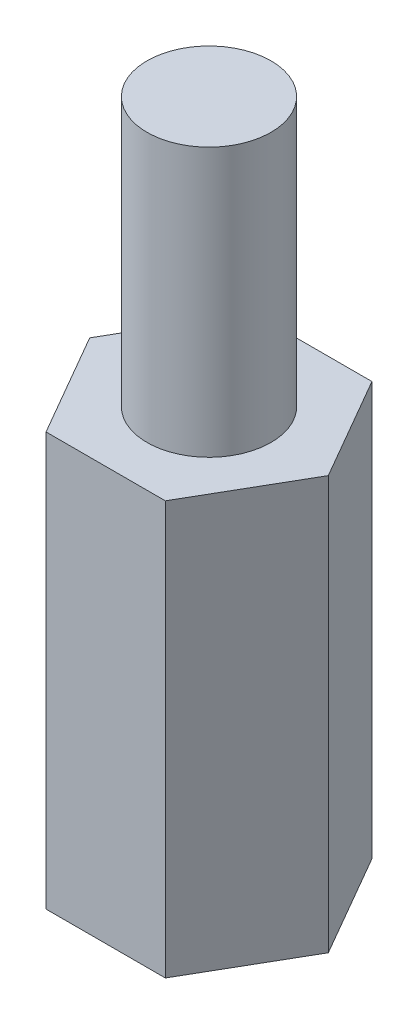
ISO-10303-21;
HEADER;
FILE_DESCRIPTION(('STEP AP214'),'2;1');
FILE_NAME('part.step','',(''),(''),'','','');
FILE_SCHEMA(('AUTOMOTIVE_DESIGN { 1 0 10303 214 1 1 1 1 }'));
ENDSEC;
DATA;
#1=APPLICATION_CONTEXT('core data for automotive mechanical design processes');
#2=APPLICATION_PROTOCOL_DEFINITION('international standard','automotive_design',2000,#1);
#3=PRODUCT_CONTEXT('',#1,'mechanical');
#4=PRODUCT('Part','Part','',(#3));
#5=PRODUCT_RELATED_PRODUCT_CATEGORY('part','',(#4));
#6=PRODUCT_DEFINITION_FORMATION('','',#4);
#7=PRODUCT_DEFINITION_CONTEXT('part definition',#1,'design');
#8=PRODUCT_DEFINITION('design','',#6,#7);
#9=PRODUCT_DEFINITION_SHAPE('','',#8);
#10=(LENGTH_UNIT() NAMED_UNIT(*) SI_UNIT(.MILLI.,.METRE.));
#11=(NAMED_UNIT(*) PLANE_ANGLE_UNIT() SI_UNIT($,.RADIAN.));
#12=(NAMED_UNIT(*) SI_UNIT($,.STERADIAN.) SOLID_ANGLE_UNIT());
#13=UNCERTAINTY_MEASURE_WITH_UNIT(LENGTH_MEASURE(1.E-05),#10,'distance_accuracy_value','');
#14=(GEOMETRIC_REPRESENTATION_CONTEXT(3) GLOBAL_UNCERTAINTY_ASSIGNED_CONTEXT((#13)) GLOBAL_UNIT_ASSIGNED_CONTEXT((#10,
#11,#12)) REPRESENTATION_CONTEXT('',''));
#15=CARTESIAN_POINT('',(0.,0.,0.));
#16=DIRECTION('',(0.,0.,1.));
#17=DIRECTION('',(1.,0.,0.));
#18=AXIS2_PLACEMENT_3D('',#15,#16,#17);
#19=CARTESIAN_POINT('',(-1.44337567297406,10.,2.5));
#20=DIRECTION('',(0.,0.,-1.));
#21=DIRECTION('',(-1.,0.,0.));
#22=AXIS2_PLACEMENT_3D('',#19,#20,#21);
#23=PLANE('',#22);
#24=DIRECTION('',(1.,0.,0.));
#25=VECTOR('',#24,1.);
#26=CARTESIAN_POINT('',(-1.44337567297406,0.,2.5));
#27=LINE('',#26,#25);
#28=CARTESIAN_POINT('',(-1.44337567297406,0.,2.5));
#29=VERTEX_POINT('',#28);
#30=CARTESIAN_POINT('',(1.44337567297406,0.,2.5));
#31=VERTEX_POINT('',#30);
#32=EDGE_CURVE('E122',#29,#31,#27,.T.);
#33=ORIENTED_EDGE('',*,*,#32,.T.);
#34=DIRECTION('',(0.,-1.,0.));
#35=VECTOR('',#34,1.);
#36=CARTESIAN_POINT('',(1.44337567297406,10.,2.5));
#37=LINE('',#36,#35);
#38=CARTESIAN_POINT('',(1.44337567297406,10.,2.5));
#39=VERTEX_POINT('',#38);
#40=EDGE_CURVE('E39',#39,#31,#37,.T.);
#41=ORIENTED_EDGE('',*,*,#40,.F.);
#42=DIRECTION('',(1.,0.,0.));
#43=VECTOR('',#42,1.);
#44=CARTESIAN_POINT('',(-1.44337567297406,10.,2.5));
#45=LINE('',#44,#43);
#46=CARTESIAN_POINT('',(-1.44337567297406,10.,2.5));
#47=VERTEX_POINT('',#46);
#48=EDGE_CURVE('E133',#47,#39,#45,.T.);
#49=ORIENTED_EDGE('',*,*,#48,.F.);
#50=DIRECTION('',(0.,-1.,0.));
#51=VECTOR('',#50,1.);
#52=CARTESIAN_POINT('',(-1.44337567297406,10.,2.5));
#53=LINE('',#52,#51);
#54=EDGE_CURVE('E118',#47,#29,#53,.T.);
#55=ORIENTED_EDGE('',*,*,#54,.T.);
#56=EDGE_LOOP('',(#33,#41,#49,#55));
#57=FACE_BOUND('',#56,.T.);
#58=ADVANCED_FACE('F36',(#57),#23,.F.);
#59=CARTESIAN_POINT('',(1.44337567297406,10.,2.5));
#60=DIRECTION('',(-0.866025403784439,0.,-0.5));
#61=DIRECTION('',(-0.5,0.,0.866025403784439));
#62=AXIS2_PLACEMENT_3D('',#59,#60,#61);
#63=PLANE('',#62);
#64=DIRECTION('',(0.5,0.,-0.866025403784439));
#65=VECTOR('',#64,1.);
#66=CARTESIAN_POINT('',(1.44337567297406,0.,2.5));
#67=LINE('',#66,#65);
#68=CARTESIAN_POINT('',(2.88675134594813,0.,0.));
#69=VERTEX_POINT('',#68);
#70=EDGE_CURVE('E125',#31,#69,#67,.T.);
#71=ORIENTED_EDGE('',*,*,#70,.T.);
#72=DIRECTION('',(0.,-1.,0.));
#73=VECTOR('',#72,1.);
#74=CARTESIAN_POINT('',(2.88675134594813,10.,0.));
#75=LINE('',#74,#73);
#76=CARTESIAN_POINT('',(2.88675134594813,10.,0.));
#77=VERTEX_POINT('',#76);
#78=EDGE_CURVE('E136',#77,#69,#75,.T.);
#79=ORIENTED_EDGE('',*,*,#78,.F.);
#80=DIRECTION('',(0.5,0.,-0.866025403784439));
#81=VECTOR('',#80,1.);
#82=CARTESIAN_POINT('',(1.44337567297406,10.,2.5));
#83=LINE('',#82,#81);
#84=EDGE_CURVE('E91',#39,#77,#83,.T.);
#85=ORIENTED_EDGE('',*,*,#84,.F.);
#86=ORIENTED_EDGE('',*,*,#40,.T.);
#87=EDGE_LOOP('',(#71,#79,#85,#86));
#88=FACE_BOUND('',#87,.T.);
#89=ADVANCED_FACE('F141',(#88),#63,.F.);
#90=CARTESIAN_POINT('',(2.88675134594813,10.,0.));
#91=DIRECTION('',(-0.866025403784438,0.,0.5));
#92=DIRECTION('',(0.5,0.,0.866025403784438));
#93=AXIS2_PLACEMENT_3D('',#90,#91,#92);
#94=PLANE('',#93);
#95=DIRECTION('',(-0.5,0.,-0.866025403784438));
#96=VECTOR('',#95,1.);
#97=CARTESIAN_POINT('',(2.88675134594813,0.,0.));
#98=LINE('',#97,#96);
#99=CARTESIAN_POINT('',(1.44337567297406,0.,-2.5));
#100=VERTEX_POINT('',#99);
#101=EDGE_CURVE('E128',#69,#100,#98,.T.);
#102=ORIENTED_EDGE('',*,*,#101,.T.);
#103=DIRECTION('',(0.,-1.,0.));
#104=VECTOR('',#103,1.);
#105=CARTESIAN_POINT('',(1.44337567297406,10.,-2.5));
#106=LINE('',#105,#104);
#107=CARTESIAN_POINT('',(1.44337567297406,10.,-2.5));
#108=VERTEX_POINT('',#107);
#109=EDGE_CURVE('E113',#108,#100,#106,.T.);
#110=ORIENTED_EDGE('',*,*,#109,.F.);
#111=DIRECTION('',(-0.5,0.,-0.866025403784438));
#112=VECTOR('',#111,1.);
#113=CARTESIAN_POINT('',(2.88675134594813,10.,0.));
#114=LINE('',#113,#112);
#115=EDGE_CURVE('E104',#77,#108,#114,.T.);
#116=ORIENTED_EDGE('',*,*,#115,.F.);
#117=ORIENTED_EDGE('',*,*,#78,.T.);
#118=EDGE_LOOP('',(#102,#110,#116,#117));
#119=FACE_BOUND('',#118,.T.);
#120=ADVANCED_FACE('F147',(#119),#94,.F.);
#121=CARTESIAN_POINT('',(1.44337567297406,10.,-2.5));
#122=DIRECTION('',(0.,0.,1.));
#123=DIRECTION('',(1.,0.,0.));
#124=AXIS2_PLACEMENT_3D('',#121,#122,#123);
#125=PLANE('',#124);
#126=DIRECTION('',(-1.,0.,0.));
#127=VECTOR('',#126,1.);
#128=CARTESIAN_POINT('',(1.44337567297406,0.,-2.5));
#129=LINE('',#128,#127);
#130=CARTESIAN_POINT('',(-1.44337567297406,0.,-2.5));
#131=VERTEX_POINT('',#130);
#132=EDGE_CURVE('E112',#100,#131,#129,.T.);
#133=ORIENTED_EDGE('',*,*,#132,.T.);
#134=DIRECTION('',(0.,-1.,0.));
#135=VECTOR('',#134,1.);
#136=CARTESIAN_POINT('',(-1.44337567297406,10.,-2.5));
#137=LINE('',#136,#135);
#138=CARTESIAN_POINT('',(-1.44337567297406,10.,-2.5));
#139=VERTEX_POINT('',#138);
#140=EDGE_CURVE('E109',#139,#131,#137,.T.);
#141=ORIENTED_EDGE('',*,*,#140,.F.);
#142=DIRECTION('',(-1.,0.,0.));
#143=VECTOR('',#142,1.);
#144=CARTESIAN_POINT('',(1.44337567297406,10.,-2.5));
#145=LINE('',#144,#143);
#146=EDGE_CURVE('E98',#108,#139,#145,.T.);
#147=ORIENTED_EDGE('',*,*,#146,.F.);
#148=ORIENTED_EDGE('',*,*,#109,.T.);
#149=EDGE_LOOP('',(#133,#141,#147,#148));
#150=FACE_BOUND('',#149,.T.);
#151=ADVANCED_FACE('F110',(#150),#125,.F.);
#152=CARTESIAN_POINT('',(-1.44337567297406,10.,-2.5));
#153=DIRECTION('',(0.866025403784439,0.,0.5));
#154=DIRECTION('',(0.5,0.,-0.866025403784439));
#155=AXIS2_PLACEMENT_3D('',#152,#153,#154);
#156=PLANE('',#155);
#157=DIRECTION('',(-0.5,0.,0.866025403784439));
#158=VECTOR('',#157,1.);
#159=CARTESIAN_POINT('',(-1.44337567297406,0.,-2.5));
#160=LINE('',#159,#158);
#161=CARTESIAN_POINT('',(-2.88675134594813,0.,0.));
#162=VERTEX_POINT('',#161);
#163=EDGE_CURVE('E76',#131,#162,#160,.T.);
#164=ORIENTED_EDGE('',*,*,#163,.T.);
#165=DIRECTION('',(0.,-1.,0.));
#166=VECTOR('',#165,1.);
#167=CARTESIAN_POINT('',(-2.88675134594813,10.,0.));
#168=LINE('',#167,#166);
#169=CARTESIAN_POINT('',(-2.88675134594813,10.,0.));
#170=VERTEX_POINT('',#169);
#171=EDGE_CURVE('E114',#170,#162,#168,.T.);
#172=ORIENTED_EDGE('',*,*,#171,.F.);
#173=DIRECTION('',(-0.5,0.,0.866025403784439));
#174=VECTOR('',#173,1.);
#175=CARTESIAN_POINT('',(-1.44337567297406,10.,-2.5));
#176=LINE('',#175,#174);
#177=EDGE_CURVE('E102',#139,#170,#176,.T.);
#178=ORIENTED_EDGE('',*,*,#177,.F.);
#179=ORIENTED_EDGE('',*,*,#140,.T.);
#180=EDGE_LOOP('',(#164,#172,#178,#179));
#181=FACE_BOUND('',#180,.T.);
#182=ADVANCED_FACE('F116',(#181),#156,.F.);
#183=CARTESIAN_POINT('',(-2.88675134594813,10.,0.));
#184=DIRECTION('',(0.866025403784438,0.,-0.500000000000001));
#185=DIRECTION('',(-0.500000000000001,0.,-0.866025403784438));
#186=AXIS2_PLACEMENT_3D('',#183,#184,#185);
#187=PLANE('',#186);
#188=DIRECTION('',(0.500000000000001,0.,0.866025403784438));
#189=VECTOR('',#188,1.);
#190=CARTESIAN_POINT('',(-2.88675134594813,0.,0.));
#191=LINE('',#190,#189);
#192=EDGE_CURVE('E82',#162,#29,#191,.T.);
#193=ORIENTED_EDGE('',*,*,#192,.T.);
#194=ORIENTED_EDGE('',*,*,#54,.F.);
#195=DIRECTION('',(0.500000000000001,0.,0.866025403784438));
#196=VECTOR('',#195,1.);
#197=CARTESIAN_POINT('',(-2.88675134594813,10.,0.));
#198=LINE('',#197,#196);
#199=EDGE_CURVE('E53',#170,#47,#198,.T.);
#200=ORIENTED_EDGE('',*,*,#199,.F.);
#201=ORIENTED_EDGE('',*,*,#171,.T.);
#202=EDGE_LOOP('',(#193,#194,#200,#201));
#203=FACE_BOUND('',#202,.T.);
#204=ADVANCED_FACE('F178',(#203),#187,.F.);
#205=CARTESIAN_POINT('',(0.,10.,0.));
#206=DIRECTION('',(0.,1.,0.));
#207=DIRECTION('',(0.,0.,1.));
#208=AXIS2_PLACEMENT_3D('',#205,#206,#207);
#209=PLANE('',#208);
#210=CARTESIAN_POINT('',(0.,10.,0.));
#211=DIRECTION('',(0.,1.,0.));
#212=DIRECTION('',(0.,0.,1.));
#213=AXIS2_PLACEMENT_3D('',#210,#211,#212);
#214=CIRCLE('',#213,1.5);
#215=CARTESIAN_POINT('',(0.,10.,-1.5));
#216=VERTEX_POINT('',#215);
#217=EDGE_CURVE('E11',#216,#216,#214,.T.);
#218=ORIENTED_EDGE('',*,*,#217,.F.);
#219=EDGE_LOOP('',(#218));
#220=FACE_BOUND('',#219,.T.);
#221=ORIENTED_EDGE('',*,*,#48,.T.);
#222=ORIENTED_EDGE('',*,*,#84,.T.);
#223=ORIENTED_EDGE('',*,*,#115,.T.);
#224=ORIENTED_EDGE('',*,*,#146,.T.);
#225=ORIENTED_EDGE('',*,*,#177,.T.);
#226=ORIENTED_EDGE('',*,*,#199,.T.);
#227=EDGE_LOOP('',(#221,#222,#223,#224,#225,#226));
#228=FACE_BOUND('',#227,.T.);
#229=ADVANCED_FACE('F100',(#220,#228),#209,.T.);
#230=CARTESIAN_POINT('',(0.,0.,0.));
#231=DIRECTION('',(0.,1.,0.));
#232=DIRECTION('',(0.,0.,1.));
#233=AXIS2_PLACEMENT_3D('',#230,#231,#232);
#234=PLANE('',#233);
#235=CARTESIAN_POINT('',(0.,0.,0.));
#236=DIRECTION('',(0.,-1.,0.));
#237=DIRECTION('',(0.,0.,-1.));
#238=AXIS2_PLACEMENT_3D('',#235,#236,#237);
#239=CIRCLE('',#238,1.5);
#240=CARTESIAN_POINT('',(0.,0.,-1.5));
#241=VERTEX_POINT('',#240);
#242=EDGE_CURVE('E154',#241,#241,#239,.T.);
#243=ORIENTED_EDGE('',*,*,#242,.F.);
#244=EDGE_LOOP('',(#243));
#245=FACE_BOUND('',#244,.T.);
#246=ORIENTED_EDGE('',*,*,#32,.F.);
#247=ORIENTED_EDGE('',*,*,#192,.F.);
#248=ORIENTED_EDGE('',*,*,#163,.F.);
#249=ORIENTED_EDGE('',*,*,#132,.F.);
#250=ORIENTED_EDGE('',*,*,#101,.F.);
#251=ORIENTED_EDGE('',*,*,#70,.F.);
#252=EDGE_LOOP('',(#246,#247,#248,#249,#250,#251));
#253=FACE_BOUND('',#252,.T.);
#254=ADVANCED_FACE('F146',(#245,#253),#234,.F.);
#255=CARTESIAN_POINT('',(0.,16.5,0.));
#256=DIRECTION('',(0.,-1.,0.));
#257=DIRECTION('',(0.,0.,-1.));
#258=AXIS2_PLACEMENT_3D('',#255,#256,#257);
#259=CYLINDRICAL_SURFACE('',#258,1.5);
#260=CARTESIAN_POINT('',(0.,16.5,0.));
#261=DIRECTION('',(0.,1.,0.));
#262=DIRECTION('',(0.,0.,1.));
#263=AXIS2_PLACEMENT_3D('',#260,#261,#262);
#264=CIRCLE('',#263,1.5);
#265=CARTESIAN_POINT('',(0.,16.5,-1.5));
#266=VERTEX_POINT('',#265);
#267=EDGE_CURVE('E126',#266,#266,#264,.T.);
#268=CARTESIAN_POINT('',(0.,16.5,-1.5));
#269=CARTESIAN_POINT('',(0.,16.4322916666667,-1.5));
#270=CARTESIAN_POINT('',(0.,16.3645833333333,-1.5));
#271=CARTESIAN_POINT('',(0.,16.2291666666667,-1.5));
#272=CARTESIAN_POINT('',(0.,16.1614583333333,-1.5));
#273=CARTESIAN_POINT('',(0.,16.0260416666667,-1.5));
#274=CARTESIAN_POINT('',(0.,15.9583333333333,-1.5));
#275=CARTESIAN_POINT('',(0.,15.8229166666667,-1.5));
#276=CARTESIAN_POINT('',(0.,15.7552083333333,-1.5));
#277=CARTESIAN_POINT('',(0.,15.6197916666667,-1.5));
#278=CARTESIAN_POINT('',(0.,15.5520833333333,-1.5));
#279=CARTESIAN_POINT('',(0.,15.4166666666667,-1.5));
#280=CARTESIAN_POINT('',(0.,15.3489583333333,-1.5));
#281=CARTESIAN_POINT('',(0.,15.2135416666667,-1.5));
#282=CARTESIAN_POINT('',(0.,15.1458333333333,-1.5));
#283=CARTESIAN_POINT('',(0.,15.0104166666667,-1.5));
#284=CARTESIAN_POINT('',(0.,14.9427083333333,-1.5));
#285=CARTESIAN_POINT('',(0.,14.8072916666667,-1.5));
#286=CARTESIAN_POINT('',(0.,14.7395833333333,-1.5));
#287=CARTESIAN_POINT('',(0.,14.6041666666667,-1.5));
#288=CARTESIAN_POINT('',(0.,14.5364583333333,-1.5));
#289=CARTESIAN_POINT('',(0.,14.4010416666667,-1.5));
#290=CARTESIAN_POINT('',(0.,14.3333333333333,-1.5));
#291=CARTESIAN_POINT('',(0.,14.1979166666667,-1.5));
#292=CARTESIAN_POINT('',(0.,14.1302083333333,-1.5));
#293=CARTESIAN_POINT('',(0.,13.9947916666667,-1.5));
#294=CARTESIAN_POINT('',(0.,13.9270833333333,-1.5));
#295=CARTESIAN_POINT('',(0.,13.7916666666667,-1.5));
#296=CARTESIAN_POINT('',(0.,13.7239583333333,-1.5));
#297=CARTESIAN_POINT('',(0.,13.5885416666667,-1.5));
#298=CARTESIAN_POINT('',(0.,13.5208333333333,-1.5));
#299=CARTESIAN_POINT('',(0.,13.3854166666667,-1.5));
#300=CARTESIAN_POINT('',(0.,13.3177083333333,-1.5));
#301=CARTESIAN_POINT('',(0.,13.1822916666667,-1.5));
#302=CARTESIAN_POINT('',(0.,13.1145833333333,-1.5));
#303=CARTESIAN_POINT('',(0.,12.9791666666667,-1.5));
#304=CARTESIAN_POINT('',(0.,12.9114583333333,-1.5));
#305=CARTESIAN_POINT('',(0.,12.7760416666667,-1.5));
#306=CARTESIAN_POINT('',(0.,12.7083333333333,-1.5));
#307=CARTESIAN_POINT('',(0.,12.5729166666667,-1.5));
#308=CARTESIAN_POINT('',(0.,12.5052083333333,-1.5));
#309=CARTESIAN_POINT('',(0.,12.3697916666667,-1.5));
#310=CARTESIAN_POINT('',(0.,12.3020833333333,-1.5));
#311=CARTESIAN_POINT('',(0.,12.1666666666667,-1.5));
#312=CARTESIAN_POINT('',(0.,12.0989583333333,-1.5));
#313=CARTESIAN_POINT('',(0.,11.9635416666667,-1.5));
#314=CARTESIAN_POINT('',(0.,11.8958333333333,-1.5));
#315=CARTESIAN_POINT('',(0.,11.7604166666667,-1.5));
#316=CARTESIAN_POINT('',(0.,11.6927083333333,-1.5));
#317=CARTESIAN_POINT('',(0.,11.5572916666667,-1.5));
#318=CARTESIAN_POINT('',(0.,11.4895833333333,-1.5));
#319=CARTESIAN_POINT('',(0.,11.3541666666667,-1.5));
#320=CARTESIAN_POINT('',(0.,11.2864583333333,-1.5));
#321=CARTESIAN_POINT('',(0.,11.1510416666667,-1.5));
#322=CARTESIAN_POINT('',(0.,11.0833333333333,-1.5));
#323=CARTESIAN_POINT('',(0.,10.9479166666667,-1.5));
#324=CARTESIAN_POINT('',(0.,10.8802083333333,-1.5));
#325=CARTESIAN_POINT('',(0.,10.7447916666667,-1.5));
#326=CARTESIAN_POINT('',(0.,10.6770833333333,-1.5));
#327=CARTESIAN_POINT('',(0.,10.5416666666667,-1.5));
#328=CARTESIAN_POINT('',(0.,10.4739583333333,-1.5));
#329=CARTESIAN_POINT('',(0.,10.3385416666667,-1.5));
#330=CARTESIAN_POINT('',(0.,10.2708333333333,-1.5));
#331=CARTESIAN_POINT('',(0.,10.1354166666667,-1.5));
#332=CARTESIAN_POINT('',(0.,10.0677083333333,-1.5));
#333=CARTESIAN_POINT('',(0.,10.,-1.5));
#334=B_SPLINE_CURVE_WITH_KNOTS('',3,(#268,#269,#270,#271,#272,#273,#274,#275,#276,#277,#278,
#279,#280,#281,#282,#283,#284,#285,#286,#287,#288,#289,#290,#291,#292,#293,#294,#295,#296,#297,
#298,#299,#300,#301,#302,#303,#304,#305,#306,#307,#308,#309,#310,#311,#312,#313,#314,#315,#316,
#317,#318,#319,#320,#321,#322,#323,#324,#325,#326,#327,#328,#329,#330,#331,#332,#333),
.UNSPECIFIED.,.F.,.F.,(4,2,2,2,2,2,2,2,2,2,2,2,2,2,2,2,2,2,2,2,2,2,2,2,2,2,2,2,2,2,2,2,4),(0.,
0.203125000000002,0.40625,0.609375000000002,0.812500000000001,1.015625,1.21875,1.421875,1.625,
1.828125,2.03125,2.234375,2.4375,2.640625,2.84375,3.046875,3.25,3.453125,3.65625,3.859375,
4.0625,4.265625,4.46875,4.671875,4.875,5.078125,5.28125,5.484375,5.6875,5.890625,6.09375,
6.296875,6.5),.UNSPECIFIED.);
#335=EDGE_CURVE('BSEAM170',#266,#216,#334,.T.);
#336=ORIENTED_EDGE('',*,*,#267,.F.);
#337=ORIENTED_EDGE('',*,*,#217,.T.);
#338=ORIENTED_EDGE('',*,*,#335,.T.);
#339=ORIENTED_EDGE('',*,*,#335,.F.);
#340=EDGE_LOOP('',(#336,#338,#337,#339));
#341=FACE_BOUND('',#340,.T.);
#342=ADVANCED_FACE('F170',(#341),#259,.T.);
#343=CARTESIAN_POINT('',(0.,16.5,0.));
#344=DIRECTION('',(0.,1.,0.));
#345=DIRECTION('',(0.,0.,1.));
#346=AXIS2_PLACEMENT_3D('',#343,#344,#345);
#347=PLANE('',#346);
#348=ORIENTED_EDGE('',*,*,#267,.T.);
#349=EDGE_LOOP('',(#348));
#350=FACE_BOUND('',#349,.T.);
#351=ADVANCED_FACE('F165',(#350),#347,.T.);
#352=CARTESIAN_POINT('',(0.,6.5,0.));
#353=DIRECTION('',(0.,-1.,0.));
#354=DIRECTION('',(0.,0.,-1.));
#355=AXIS2_PLACEMENT_3D('',#352,#353,#354);
#356=CYLINDRICAL_SURFACE('',#355,1.5);
#357=CARTESIAN_POINT('',(0.,6.5,0.));
#358=DIRECTION('',(0.,-1.,0.));
#359=DIRECTION('',(0.,0.,-1.));
#360=AXIS2_PLACEMENT_3D('',#357,#358,#359);
#361=CIRCLE('',#360,1.5);
#362=CARTESIAN_POINT('',(0.,6.5,-1.5));
#363=VERTEX_POINT('',#362);
#364=EDGE_CURVE('E153',#363,#363,#361,.T.);
#365=CARTESIAN_POINT('',(0.,6.5,-1.5));
#366=CARTESIAN_POINT('',(0.,6.43229166666667,-1.5));
#367=CARTESIAN_POINT('',(0.,6.36458333333333,-1.5));
#368=CARTESIAN_POINT('',(0.,6.22916666666667,-1.5));
#369=CARTESIAN_POINT('',(0.,6.16145833333333,-1.5));
#370=CARTESIAN_POINT('',(0.,6.02604166666667,-1.5));
#371=CARTESIAN_POINT('',(0.,5.95833333333333,-1.5));
#372=CARTESIAN_POINT('',(0.,5.82291666666667,-1.5));
#373=CARTESIAN_POINT('',(0.,5.75520833333333,-1.5));
#374=CARTESIAN_POINT('',(0.,5.61979166666667,-1.5));
#375=CARTESIAN_POINT('',(0.,5.55208333333333,-1.5));
#376=CARTESIAN_POINT('',(0.,5.41666666666667,-1.5));
#377=CARTESIAN_POINT('',(0.,5.34895833333333,-1.5));
#378=CARTESIAN_POINT('',(0.,5.21354166666667,-1.5));
#379=CARTESIAN_POINT('',(0.,5.14583333333333,-1.5));
#380=CARTESIAN_POINT('',(0.,5.01041666666667,-1.5));
#381=CARTESIAN_POINT('',(0.,4.94270833333333,-1.5));
#382=CARTESIAN_POINT('',(0.,4.80729166666667,-1.5));
#383=CARTESIAN_POINT('',(0.,4.73958333333333,-1.5));
#384=CARTESIAN_POINT('',(0.,4.60416666666667,-1.5));
#385=CARTESIAN_POINT('',(0.,4.53645833333333,-1.5));
#386=CARTESIAN_POINT('',(0.,4.40104166666667,-1.5));
#387=CARTESIAN_POINT('',(0.,4.33333333333333,-1.5));
#388=CARTESIAN_POINT('',(0.,4.19791666666667,-1.5));
#389=CARTESIAN_POINT('',(0.,4.13020833333333,-1.5));
#390=CARTESIAN_POINT('',(0.,3.99479166666667,-1.5));
#391=CARTESIAN_POINT('',(0.,3.92708333333333,-1.5));
#392=CARTESIAN_POINT('',(0.,3.79166666666667,-1.5));
#393=CARTESIAN_POINT('',(0.,3.72395833333333,-1.5));
#394=CARTESIAN_POINT('',(0.,3.58854166666667,-1.5));
#395=CARTESIAN_POINT('',(0.,3.52083333333333,-1.5));
#396=CARTESIAN_POINT('',(0.,3.38541666666667,-1.5));
#397=CARTESIAN_POINT('',(0.,3.31770833333333,-1.5));
#398=CARTESIAN_POINT('',(0.,3.18229166666667,-1.5));
#399=CARTESIAN_POINT('',(0.,3.11458333333333,-1.5));
#400=CARTESIAN_POINT('',(0.,2.97916666666667,-1.5));
#401=CARTESIAN_POINT('',(0.,2.91145833333333,-1.5));
#402=CARTESIAN_POINT('',(0.,2.77604166666667,-1.5));
#403=CARTESIAN_POINT('',(0.,2.70833333333333,-1.5));
#404=CARTESIAN_POINT('',(0.,2.57291666666667,-1.5));
#405=CARTESIAN_POINT('',(0.,2.50520833333333,-1.5));
#406=CARTESIAN_POINT('',(0.,2.36979166666667,-1.5));
#407=CARTESIAN_POINT('',(0.,2.30208333333333,-1.5));
#408=CARTESIAN_POINT('',(0.,2.16666666666667,-1.5));
#409=CARTESIAN_POINT('',(0.,2.09895833333333,-1.5));
#410=CARTESIAN_POINT('',(0.,1.96354166666667,-1.5));
#411=CARTESIAN_POINT('',(0.,1.89583333333333,-1.5));
#412=CARTESIAN_POINT('',(0.,1.76041666666667,-1.5));
#413=CARTESIAN_POINT('',(0.,1.69270833333333,-1.5));
#414=CARTESIAN_POINT('',(0.,1.55729166666667,-1.5));
#415=CARTESIAN_POINT('',(0.,1.48958333333333,-1.5));
#416=CARTESIAN_POINT('',(0.,1.35416666666667,-1.5));
#417=CARTESIAN_POINT('',(0.,1.28645833333333,-1.5));
#418=CARTESIAN_POINT('',(0.,1.15104166666667,-1.5));
#419=CARTESIAN_POINT('',(0.,1.08333333333333,-1.5));
#420=CARTESIAN_POINT('',(0.,0.947916666666667,-1.5));
#421=CARTESIAN_POINT('',(0.,0.880208333333333,-1.5));
#422=CARTESIAN_POINT('',(0.,0.744791666666667,-1.5));
#423=CARTESIAN_POINT('',(0.,0.677083333333333,-1.5));
#424=CARTESIAN_POINT('',(0.,0.541666666666667,-1.5));
#425=CARTESIAN_POINT('',(0.,0.473958333333333,-1.5));
#426=CARTESIAN_POINT('',(0.,0.338541666666667,-1.5));
#427=CARTESIAN_POINT('',(0.,0.270833333333334,-1.5));
#428=CARTESIAN_POINT('',(0.,0.135416666666667,-1.5));
#429=CARTESIAN_POINT('',(0.,0.0677083333333334,-1.5));
#430=CARTESIAN_POINT('',(0.,0.,-1.5));
#431=B_SPLINE_CURVE_WITH_KNOTS('',3,(#365,#366,#367,#368,#369,#370,#371,#372,#373,#374,#375,
#376,#377,#378,#379,#380,#381,#382,#383,#384,#385,#386,#387,#388,#389,#390,#391,#392,#393,#394,
#395,#396,#397,#398,#399,#400,#401,#402,#403,#404,#405,#406,#407,#408,#409,#410,#411,#412,#413,
#414,#415,#416,#417,#418,#419,#420,#421,#422,#423,#424,#425,#426,#427,#428,#429,#430),
.UNSPECIFIED.,.F.,.F.,(4,2,2,2,2,2,2,2,2,2,2,2,2,2,2,2,2,2,2,2,2,2,2,2,2,2,2,2,2,2,2,2,4),(0.,
0.203124999999999,0.40625,0.609375,0.8125,1.015625,1.21875,1.421875,1.625,1.828125,2.03125,
2.234375,2.4375,2.640625,2.84375,3.046875,3.25,3.453125,3.65625,3.859375,4.0625,4.265625,
4.46875,4.671875,4.875,5.078125,5.28125,5.484375,5.6875,5.890625,6.09375,6.296875,6.5),.UNSPECIFIED.);
#432=EDGE_CURVE('BSEAM162',#363,#241,#431,.T.);
#433=ORIENTED_EDGE('',*,*,#364,.F.);
#434=ORIENTED_EDGE('',*,*,#242,.T.);
#435=ORIENTED_EDGE('',*,*,#432,.T.);
#436=ORIENTED_EDGE('',*,*,#432,.F.);
#437=EDGE_LOOP('',(#433,#435,#434,#436));
#438=FACE_BOUND('',#437,.T.);
#439=ADVANCED_FACE('F162',(#438),#356,.F.);
#440=CARTESIAN_POINT('',(0.,6.5,0.));
#441=DIRECTION('',(0.,-1.,0.));
#442=DIRECTION('',(0.,0.,-1.));
#443=AXIS2_PLACEMENT_3D('',#440,#441,#442);
#444=PLANE('',#443);
#445=ORIENTED_EDGE('',*,*,#364,.T.);
#446=EDGE_LOOP('',(#445));
#447=FACE_BOUND('',#446,.T.);
#448=ADVANCED_FACE('F160',(#447),#444,.T.);
#449=CLOSED_SHELL('',(#58,#89,#120,#151,#182,#204,#229,#254,#342,#351,#439,#448));
#450=MANIFOLD_SOLID_BREP('B2',#449);
#451=ADVANCED_BREP_SHAPE_REPRESENTATION('',(#18,#450),#14);
#452=SHAPE_DEFINITION_REPRESENTATION(#9,#451);
ENDSEC;
END-ISO-10303-21;
